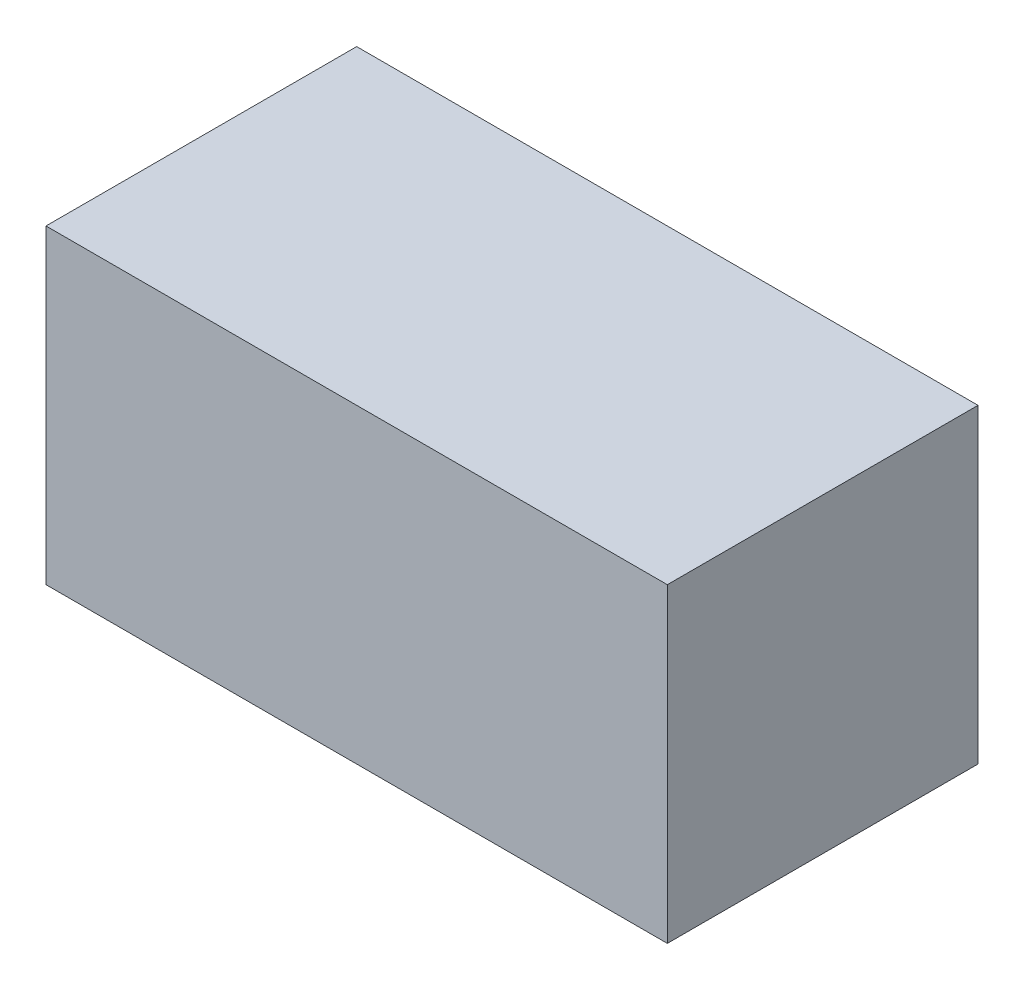
ISO-10303-21;
HEADER;
FILE_DESCRIPTION(('STEP AP214'),'2;1');
FILE_NAME('part.step','',(''),(''),'','','');
FILE_SCHEMA(('AUTOMOTIVE_DESIGN { 1 0 10303 214 1 1 1 1 }'));
ENDSEC;
DATA;
#1=APPLICATION_CONTEXT('core data for automotive mechanical design processes');
#2=APPLICATION_PROTOCOL_DEFINITION('international standard','automotive_design',2000,#1);
#3=PRODUCT_CONTEXT('',#1,'mechanical');
#4=PRODUCT('Part','Part','',(#3));
#5=PRODUCT_RELATED_PRODUCT_CATEGORY('part','',(#4));
#6=PRODUCT_DEFINITION_FORMATION('','',#4);
#7=PRODUCT_DEFINITION_CONTEXT('part definition',#1,'design');
#8=PRODUCT_DEFINITION('design','',#6,#7);
#9=PRODUCT_DEFINITION_SHAPE('','',#8);
#10=(LENGTH_UNIT() NAMED_UNIT(*) SI_UNIT(.MILLI.,.METRE.));
#11=(NAMED_UNIT(*) PLANE_ANGLE_UNIT() SI_UNIT($,.RADIAN.));
#12=(NAMED_UNIT(*) SI_UNIT($,.STERADIAN.) SOLID_ANGLE_UNIT());
#13=UNCERTAINTY_MEASURE_WITH_UNIT(LENGTH_MEASURE(1.E-05),#10,'distance_accuracy_value','');
#14=(GEOMETRIC_REPRESENTATION_CONTEXT(3) GLOBAL_UNCERTAINTY_ASSIGNED_CONTEXT((#13)) GLOBAL_UNIT_ASSIGNED_CONTEXT((#10,
#11,#12)) REPRESENTATION_CONTEXT('',''));
#15=CARTESIAN_POINT('',(0.,0.,0.));
#16=DIRECTION('',(0.,0.,1.));
#17=DIRECTION('',(1.,0.,0.));
#18=AXIS2_PLACEMENT_3D('',#15,#16,#17);
#19=CARTESIAN_POINT('',(0.,0.,35.));
#20=DIRECTION('',(1.,0.,0.));
#21=DIRECTION('',(0.,0.,-1.));
#22=AXIS2_PLACEMENT_3D('',#19,#20,#21);
#23=PLANE('',#22);
#24=DIRECTION('',(0.,-1.,0.));
#25=VECTOR('',#24,1.);
#26=CARTESIAN_POINT('',(0.,0.,0.));
#27=LINE('',#26,#25);
#28=CARTESIAN_POINT('',(0.,35.,0.));
#29=VERTEX_POINT('',#28);
#30=CARTESIAN_POINT('',(0.,0.,0.));
#31=VERTEX_POINT('',#30);
#32=EDGE_CURVE('E98',#29,#31,#27,.T.);
#33=ORIENTED_EDGE('',*,*,#32,.T.);
#34=DIRECTION('',(0.,0.,-1.));
#35=VECTOR('',#34,1.);
#36=CARTESIAN_POINT('',(0.,0.,35.));
#37=LINE('',#36,#35);
#38=CARTESIAN_POINT('',(0.,0.,35.));
#39=VERTEX_POINT('',#38);
#40=EDGE_CURVE('E11',#39,#31,#37,.T.);
#41=ORIENTED_EDGE('',*,*,#40,.F.);
#42=DIRECTION('',(0.,-1.,0.));
#43=VECTOR('',#42,1.);
#44=CARTESIAN_POINT('',(0.,0.,35.));
#45=LINE('',#44,#43);
#46=CARTESIAN_POINT('',(0.,35.,35.));
#47=VERTEX_POINT('',#46);
#48=EDGE_CURVE('E86',#47,#39,#45,.T.);
#49=ORIENTED_EDGE('',*,*,#48,.F.);
#50=DIRECTION('',(0.,0.,-1.));
#51=VECTOR('',#50,1.);
#52=CARTESIAN_POINT('',(0.,35.,35.));
#53=LINE('',#52,#51);
#54=EDGE_CURVE('E94',#47,#29,#53,.T.);
#55=ORIENTED_EDGE('',*,*,#54,.T.);
#56=EDGE_LOOP('',(#33,#41,#49,#55));
#57=FACE_BOUND('',#56,.T.);
#58=ADVANCED_FACE('F35',(#57),#23,.F.);
#59=CARTESIAN_POINT('',(0.,0.,35.));
#60=DIRECTION('',(0.,1.,0.));
#61=DIRECTION('',(0.,0.,1.));
#62=AXIS2_PLACEMENT_3D('',#59,#60,#61);
#63=PLANE('',#62);
#64=DIRECTION('',(1.,0.,0.));
#65=VECTOR('',#64,1.);
#66=CARTESIAN_POINT('',(0.,0.,0.));
#67=LINE('',#66,#65);
#68=CARTESIAN_POINT('',(70.,0.,0.));
#69=VERTEX_POINT('',#68);
#70=EDGE_CURVE('E90',#31,#69,#67,.T.);
#71=ORIENTED_EDGE('',*,*,#70,.T.);
#72=DIRECTION('',(0.,0.,-1.));
#73=VECTOR('',#72,1.);
#74=CARTESIAN_POINT('',(70.,0.,35.));
#75=LINE('',#74,#73);
#76=CARTESIAN_POINT('',(70.,0.,35.));
#77=VERTEX_POINT('',#76);
#78=EDGE_CURVE('E43',#77,#69,#75,.T.);
#79=ORIENTED_EDGE('',*,*,#78,.F.);
#80=DIRECTION('',(1.,0.,0.));
#81=VECTOR('',#80,1.);
#82=CARTESIAN_POINT('',(0.,0.,35.));
#83=LINE('',#82,#81);
#84=EDGE_CURVE('E81',#39,#77,#83,.T.);
#85=ORIENTED_EDGE('',*,*,#84,.F.);
#86=ORIENTED_EDGE('',*,*,#40,.T.);
#87=EDGE_LOOP('',(#71,#79,#85,#86));
#88=FACE_BOUND('',#87,.T.);
#89=ADVANCED_FACE('F89',(#88),#63,.F.);
#90=CARTESIAN_POINT('',(70.,0.,35.));
#91=DIRECTION('',(-1.,0.,0.));
#92=DIRECTION('',(0.,0.,1.));
#93=AXIS2_PLACEMENT_3D('',#90,#91,#92);
#94=PLANE('',#93);
#95=DIRECTION('',(0.,1.,0.));
#96=VECTOR('',#95,1.);
#97=CARTESIAN_POINT('',(70.,0.,0.));
#98=LINE('',#97,#96);
#99=CARTESIAN_POINT('',(70.,35.,0.));
#100=VERTEX_POINT('',#99);
#101=EDGE_CURVE('E68',#69,#100,#98,.T.);
#102=ORIENTED_EDGE('',*,*,#101,.T.);
#103=DIRECTION('',(0.,0.,-1.));
#104=VECTOR('',#103,1.);
#105=CARTESIAN_POINT('',(70.,35.,35.));
#106=LINE('',#105,#104);
#107=CARTESIAN_POINT('',(70.,35.,35.));
#108=VERTEX_POINT('',#107);
#109=EDGE_CURVE('E91',#108,#100,#106,.T.);
#110=ORIENTED_EDGE('',*,*,#109,.F.);
#111=DIRECTION('',(0.,1.,0.));
#112=VECTOR('',#111,1.);
#113=CARTESIAN_POINT('',(70.,0.,35.));
#114=LINE('',#113,#112);
#115=EDGE_CURVE('E84',#77,#108,#114,.T.);
#116=ORIENTED_EDGE('',*,*,#115,.F.);
#117=ORIENTED_EDGE('',*,*,#78,.T.);
#118=EDGE_LOOP('',(#102,#110,#116,#117));
#119=FACE_BOUND('',#118,.T.);
#120=ADVANCED_FACE('F92',(#119),#94,.F.);
#121=CARTESIAN_POINT('',(0.,35.,35.));
#122=DIRECTION('',(0.,-1.,0.));
#123=DIRECTION('',(0.,0.,-1.));
#124=AXIS2_PLACEMENT_3D('',#121,#122,#123);
#125=PLANE('',#124);
#126=DIRECTION('',(-1.,0.,0.));
#127=VECTOR('',#126,1.);
#128=CARTESIAN_POINT('',(0.,35.,0.));
#129=LINE('',#128,#127);
#130=EDGE_CURVE('E74',#100,#29,#129,.T.);
#131=ORIENTED_EDGE('',*,*,#130,.T.);
#132=ORIENTED_EDGE('',*,*,#54,.F.);
#133=DIRECTION('',(-1.,0.,0.));
#134=VECTOR('',#133,1.);
#135=CARTESIAN_POINT('',(0.,35.,35.));
#136=LINE('',#135,#134);
#137=EDGE_CURVE('E51',#108,#47,#136,.T.);
#138=ORIENTED_EDGE('',*,*,#137,.F.);
#139=ORIENTED_EDGE('',*,*,#109,.T.);
#140=EDGE_LOOP('',(#131,#132,#138,#139));
#141=FACE_BOUND('',#140,.T.);
#142=ADVANCED_FACE('F105',(#141),#125,.F.);
#143=CARTESIAN_POINT('',(0.,0.,35.));
#144=DIRECTION('',(0.,0.,-1.));
#145=DIRECTION('',(-1.,0.,0.));
#146=AXIS2_PLACEMENT_3D('',#143,#144,#145);
#147=PLANE('',#146);
#148=ORIENTED_EDGE('',*,*,#48,.T.);
#149=ORIENTED_EDGE('',*,*,#84,.T.);
#150=ORIENTED_EDGE('',*,*,#115,.T.);
#151=ORIENTED_EDGE('',*,*,#137,.T.);
#152=EDGE_LOOP('',(#148,#149,#150,#151));
#153=FACE_BOUND('',#152,.T.);
#154=ADVANCED_FACE('F82',(#153),#147,.F.);
#155=CARTESIAN_POINT('',(0.,0.,0.));
#156=DIRECTION('',(0.,0.,-1.));
#157=DIRECTION('',(-1.,0.,0.));
#158=AXIS2_PLACEMENT_3D('',#155,#156,#157);
#159=PLANE('',#158);
#160=ORIENTED_EDGE('',*,*,#32,.F.);
#161=ORIENTED_EDGE('',*,*,#130,.F.);
#162=ORIENTED_EDGE('',*,*,#101,.F.);
#163=ORIENTED_EDGE('',*,*,#70,.F.);
#164=EDGE_LOOP('',(#160,#161,#162,#163));
#165=FACE_BOUND('',#164,.T.);
#166=ADVANCED_FACE('F108',(#165),#159,.T.);
#167=CLOSED_SHELL('',(#58,#89,#120,#142,#154,#166));
#168=MANIFOLD_SOLID_BREP('B2',#167);
#169=ADVANCED_BREP_SHAPE_REPRESENTATION('',(#18,#168),#14);
#170=SHAPE_DEFINITION_REPRESENTATION(#9,#169);
ENDSEC;
END-ISO-10303-21;
